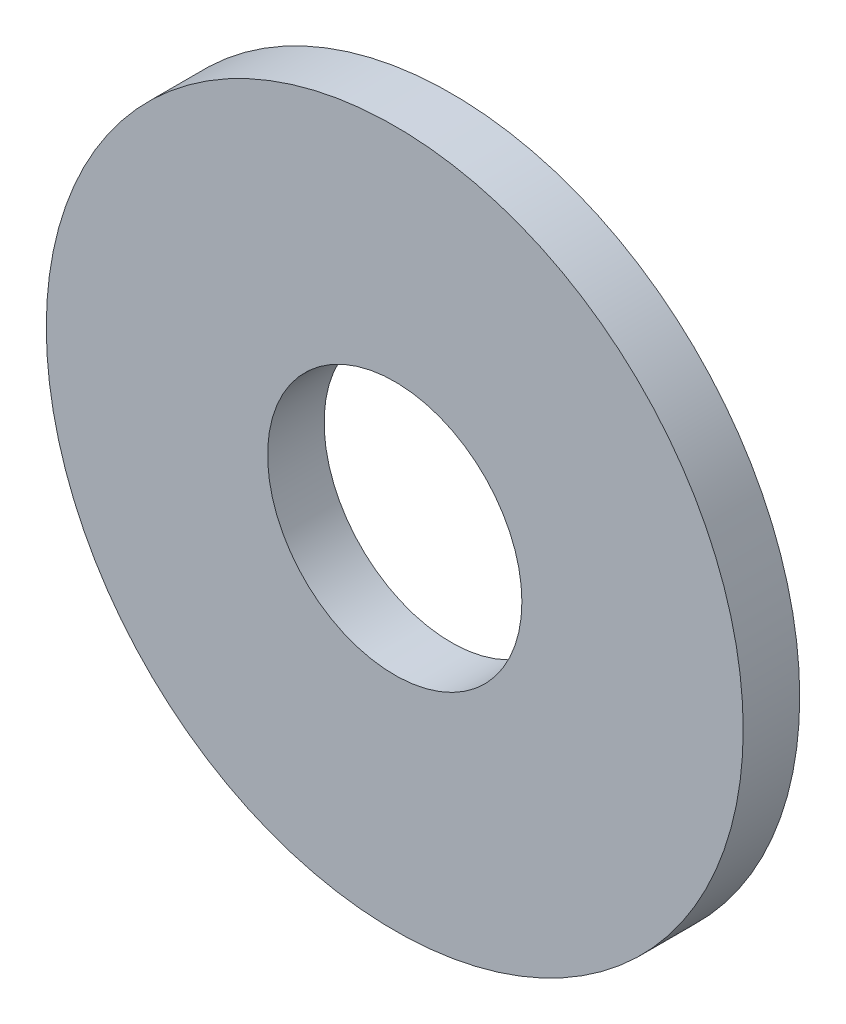
ISO-10303-21;
HEADER;
FILE_DESCRIPTION(('STEP AP214'),'2;1');
FILE_NAME('part.step','',(''),(''),'','','');
FILE_SCHEMA(('AUTOMOTIVE_DESIGN { 1 0 10303 214 1 1 1 1 }'));
ENDSEC;
DATA;
#1=APPLICATION_CONTEXT('core data for automotive mechanical design processes');
#2=APPLICATION_PROTOCOL_DEFINITION('international standard','automotive_design',2000,#1);
#3=PRODUCT_CONTEXT('',#1,'mechanical');
#4=PRODUCT('Part','Part','',(#3));
#5=PRODUCT_RELATED_PRODUCT_CATEGORY('part','',(#4));
#6=PRODUCT_DEFINITION_FORMATION('','',#4);
#7=PRODUCT_DEFINITION_CONTEXT('part definition',#1,'design');
#8=PRODUCT_DEFINITION('design','',#6,#7);
#9=PRODUCT_DEFINITION_SHAPE('','',#8);
#10=(LENGTH_UNIT() NAMED_UNIT(*) SI_UNIT(.MILLI.,.METRE.));
#11=(NAMED_UNIT(*) PLANE_ANGLE_UNIT() SI_UNIT($,.RADIAN.));
#12=(NAMED_UNIT(*) SI_UNIT($,.STERADIAN.) SOLID_ANGLE_UNIT());
#13=UNCERTAINTY_MEASURE_WITH_UNIT(LENGTH_MEASURE(1.E-05),#10,'distance_accuracy_value','');
#14=(GEOMETRIC_REPRESENTATION_CONTEXT(3) GLOBAL_UNCERTAINTY_ASSIGNED_CONTEXT((#13)) GLOBAL_UNIT_ASSIGNED_CONTEXT((#10,
#11,#12)) REPRESENTATION_CONTEXT('',''));
#15=CARTESIAN_POINT('',(0.,0.,0.));
#16=DIRECTION('',(0.,0.,1.));
#17=DIRECTION('',(1.,0.,0.));
#18=AXIS2_PLACEMENT_3D('',#15,#16,#17);
#19=CARTESIAN_POINT('',(0.,0.,0.6));
#20=DIRECTION('',(0.,0.,1.));
#21=DIRECTION('',(1.,0.,0.));
#22=AXIS2_PLACEMENT_3D('',#19,#20,#21);
#23=PLANE('',#22);
#24=CARTESIAN_POINT('',(0.,0.,0.6));
#25=DIRECTION('',(0.,0.,1.));
#26=DIRECTION('',(1.,0.,0.));
#27=AXIS2_PLACEMENT_3D('',#24,#25,#26);
#28=CIRCLE('',#27,7.4);
#29=CARTESIAN_POINT('',(7.4,0.,0.6));
#30=VERTEX_POINT('',#29);
#31=EDGE_CURVE('E10',#30,#30,#28,.T.);
#32=ORIENTED_EDGE('',*,*,#31,.T.);
#33=EDGE_LOOP('',(#32));
#34=FACE_BOUND('',#33,.T.);
#35=CARTESIAN_POINT('',(0.,0.,0.6));
#36=DIRECTION('',(0.,0.,1.));
#37=DIRECTION('',(1.,0.,0.));
#38=AXIS2_PLACEMENT_3D('',#35,#36,#37);
#39=CIRCLE('',#38,2.7);
#40=CARTESIAN_POINT('',(2.7,0.,0.6));
#41=VERTEX_POINT('',#40);
#42=EDGE_CURVE('E52',#41,#41,#39,.T.);
#43=ORIENTED_EDGE('',*,*,#42,.F.);
#44=EDGE_LOOP('',(#43));
#45=FACE_BOUND('',#44,.T.);
#46=ADVANCED_FACE('F39',(#34,#45),#23,.T.);
#47=CARTESIAN_POINT('',(0.,0.,-0.6));
#48=DIRECTION('',(0.,0.,1.));
#49=DIRECTION('',(1.,0.,0.));
#50=AXIS2_PLACEMENT_3D('',#47,#48,#49);
#51=PLANE('',#50);
#52=CARTESIAN_POINT('',(0.,0.,-0.6));
#53=DIRECTION('',(0.,0.,1.));
#54=DIRECTION('',(1.,0.,0.));
#55=AXIS2_PLACEMENT_3D('',#52,#53,#54);
#56=CIRCLE('',#55,7.4);
#57=CARTESIAN_POINT('',(7.4,0.,-0.6));
#58=VERTEX_POINT('',#57);
#59=EDGE_CURVE('E43',#58,#58,#56,.T.);
#60=ORIENTED_EDGE('',*,*,#59,.F.);
#61=EDGE_LOOP('',(#60));
#62=FACE_BOUND('',#61,.T.);
#63=CARTESIAN_POINT('',(0.,0.,-0.6));
#64=DIRECTION('',(0.,0.,1.));
#65=DIRECTION('',(1.,0.,0.));
#66=AXIS2_PLACEMENT_3D('',#63,#64,#65);
#67=CIRCLE('',#66,2.7);
#68=CARTESIAN_POINT('',(2.7,0.,-0.6));
#69=VERTEX_POINT('',#68);
#70=EDGE_CURVE('E54',#69,#69,#67,.T.);
#71=ORIENTED_EDGE('',*,*,#70,.T.);
#72=EDGE_LOOP('',(#71));
#73=FACE_BOUND('',#72,.T.);
#74=ADVANCED_FACE('F66',(#62,#73),#51,.F.);
#75=CARTESIAN_POINT('',(0.,0.,0.6));
#76=DIRECTION('',(0.,0.,-1.));
#77=DIRECTION('',(-1.,0.,0.));
#78=AXIS2_PLACEMENT_3D('',#75,#76,#77);
#79=CYLINDRICAL_SURFACE('',#78,7.4);
#80=ORIENTED_EDGE('',*,*,#31,.F.);
#81=EDGE_LOOP('',(#80));
#82=FACE_BOUND('',#81,.T.);
#83=ORIENTED_EDGE('',*,*,#59,.T.);
#84=EDGE_LOOP('',(#83));
#85=FACE_BOUND('',#84,.T.);
#86=ADVANCED_FACE('F41',(#82,#85),#79,.T.);
#87=CARTESIAN_POINT('',(0.,0.,0.6));
#88=DIRECTION('',(0.,0.,-1.));
#89=DIRECTION('',(-1.,0.,0.));
#90=AXIS2_PLACEMENT_3D('',#87,#88,#89);
#91=CYLINDRICAL_SURFACE('',#90,2.7);
#92=ORIENTED_EDGE('',*,*,#42,.T.);
#93=EDGE_LOOP('',(#92));
#94=FACE_BOUND('',#93,.T.);
#95=ORIENTED_EDGE('',*,*,#70,.F.);
#96=EDGE_LOOP('',(#95));
#97=FACE_BOUND('',#96,.T.);
#98=ADVANCED_FACE('F62',(#94,#97),#91,.F.);
#99=CLOSED_SHELL('',(#46,#74,#86,#98));
#100=MANIFOLD_SOLID_BREP('B2',#99);
#101=ADVANCED_BREP_SHAPE_REPRESENTATION('',(#18,#100),#14);
#102=SHAPE_DEFINITION_REPRESENTATION(#9,#101);
ENDSEC;
END-ISO-10303-21;
